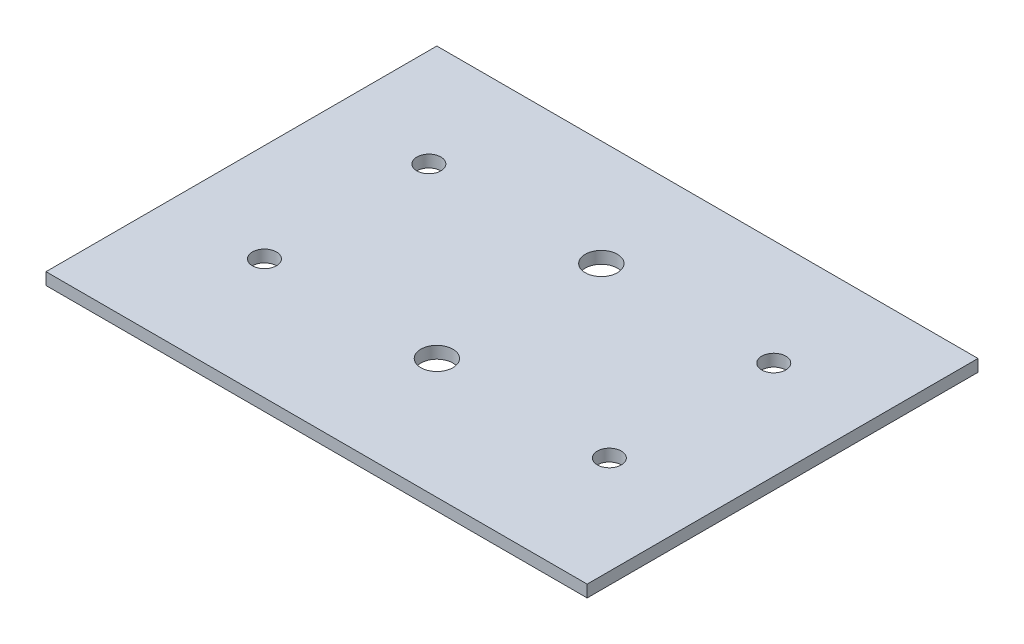
ISO-10303-21;
HEADER;
FILE_DESCRIPTION(('STEP AP214'),'2;1');
FILE_NAME('part.step','',(''),(''),'','','');
FILE_SCHEMA(('AUTOMOTIVE_DESIGN { 1 0 10303 214 1 1 1 1 }'));
ENDSEC;
DATA;
#1=APPLICATION_CONTEXT('core data for automotive mechanical design processes');
#2=APPLICATION_PROTOCOL_DEFINITION('international standard','automotive_design',2000,#1);
#3=PRODUCT_CONTEXT('',#1,'mechanical');
#4=PRODUCT('Part','Part','',(#3));
#5=PRODUCT_RELATED_PRODUCT_CATEGORY('part','',(#4));
#6=PRODUCT_DEFINITION_FORMATION('','',#4);
#7=PRODUCT_DEFINITION_CONTEXT('part definition',#1,'design');
#8=PRODUCT_DEFINITION('design','',#6,#7);
#9=PRODUCT_DEFINITION_SHAPE('','',#8);
#10=(LENGTH_UNIT() NAMED_UNIT(*) SI_UNIT(.MILLI.,.METRE.));
#11=(NAMED_UNIT(*) PLANE_ANGLE_UNIT() SI_UNIT($,.RADIAN.));
#12=(NAMED_UNIT(*) SI_UNIT($,.STERADIAN.) SOLID_ANGLE_UNIT());
#13=UNCERTAINTY_MEASURE_WITH_UNIT(LENGTH_MEASURE(1.E-05),#10,'distance_accuracy_value','');
#14=(GEOMETRIC_REPRESENTATION_CONTEXT(3) GLOBAL_UNCERTAINTY_ASSIGNED_CONTEXT((#13)) GLOBAL_UNIT_ASSIGNED_CONTEXT((#10,
#11,#12)) REPRESENTATION_CONTEXT('',''));
#15=CARTESIAN_POINT('',(0.,0.,0.));
#16=DIRECTION('',(0.,0.,1.));
#17=DIRECTION('',(1.,0.,0.));
#18=AXIS2_PLACEMENT_3D('',#15,#16,#17);
#19=CARTESIAN_POINT('',(0.,75.,0.));
#20=DIRECTION('',(0.,1.,0.));
#21=DIRECTION('',(0.,0.,1.));
#22=AXIS2_PLACEMENT_3D('',#19,#20,#21);
#23=PLANE('',#22);
#24=CARTESIAN_POINT('',(2.22044604925031E-13,75.,468.225517098027));
#25=DIRECTION('',(0.,1.,0.));
#26=DIRECTION('',(0.,0.,1.));
#27=AXIS2_PLACEMENT_3D('',#24,#25,#26);
#28=CIRCLE('',#27,100.);
#29=CARTESIAN_POINT('',(2.22044604925031E-13,75.,568.225517098027));
#30=VERTEX_POINT('',#29);
#31=EDGE_CURVE('E166',#30,#30,#28,.T.);
#32=ORIENTED_EDGE('',*,*,#31,.F.);
#33=EDGE_LOOP('',(#32));
#34=FACE_BOUND('',#33,.T.);
#35=CARTESIAN_POINT('',(-1075.,75.,468.225517098027));
#36=DIRECTION('',(0.,1.,0.));
#37=DIRECTION('',(0.,0.,-1.));
#38=AXIS2_PLACEMENT_3D('',#35,#36,#37);
#39=CIRCLE('',#38,74.9999999999999);
#40=CARTESIAN_POINT('',(-1075.,75.,393.225517098027));
#41=VERTEX_POINT('',#40);
#42=EDGE_CURVE('E150',#41,#41,#39,.T.);
#43=ORIENTED_EDGE('',*,*,#42,.F.);
#44=EDGE_LOOP('',(#43));
#45=FACE_BOUND('',#44,.T.);
#46=CARTESIAN_POINT('',(1075.,75.,468.225517098027));
#47=DIRECTION('',(0.,1.,0.));
#48=DIRECTION('',(0.,0.,1.));
#49=AXIS2_PLACEMENT_3D('',#46,#47,#48);
#50=CIRCLE('',#49,75.);
#51=CARTESIAN_POINT('',(1075.,75.,543.225517098027));
#52=VERTEX_POINT('',#51);
#53=EDGE_CURVE('E120',#52,#52,#50,.T.);
#54=ORIENTED_EDGE('',*,*,#53,.F.);
#55=EDGE_LOOP('',(#54));
#56=FACE_BOUND('',#55,.T.);
#57=DIRECTION('',(0.,0.,-1.));
#58=VECTOR('',#57,1.);
#59=CARTESIAN_POINT('',(1686.77379290496,75.,-1218.22551709803));
#60=LINE('',#59,#58);
#61=CARTESIAN_POINT('',(1686.77379290496,75.,1218.22551709803));
#62=VERTEX_POINT('',#61);
#63=CARTESIAN_POINT('',(1686.77379290496,75.,-1218.22551709803));
#64=VERTEX_POINT('',#63);
#65=EDGE_CURVE('E100',#62,#64,#60,.T.);
#66=ORIENTED_EDGE('',*,*,#65,.T.);
#67=DIRECTION('',(-1.,0.,0.));
#68=VECTOR('',#67,1.);
#69=CARTESIAN_POINT('',(-1686.77379290496,75.,-1218.22551709803));
#70=LINE('',#69,#68);
#71=CARTESIAN_POINT('',(-1686.77379290496,75.,-1218.22551709803));
#72=VERTEX_POINT('',#71);
#73=EDGE_CURVE('E95',#64,#72,#70,.T.);
#74=ORIENTED_EDGE('',*,*,#73,.T.);
#75=DIRECTION('',(0.,0.,1.));
#76=VECTOR('',#75,1.);
#77=CARTESIAN_POINT('',(-1686.77379290496,75.,-1218.22551709803));
#78=LINE('',#77,#76);
#79=CARTESIAN_POINT('',(-1686.77379290496,75.,1218.22551709803));
#80=VERTEX_POINT('',#79);
#81=EDGE_CURVE('E98',#72,#80,#78,.T.);
#82=ORIENTED_EDGE('',*,*,#81,.T.);
#83=DIRECTION('',(1.,0.,0.));
#84=VECTOR('',#83,1.);
#85=CARTESIAN_POINT('',(-1686.77379290496,75.,1218.22551709803));
#86=LINE('',#85,#84);
#87=EDGE_CURVE('E65',#80,#62,#86,.T.);
#88=ORIENTED_EDGE('',*,*,#87,.T.);
#89=EDGE_LOOP('',(#66,#74,#82,#88));
#90=FACE_BOUND('',#89,.T.);
#91=CARTESIAN_POINT('',(1075.,75.,-556.774482901973));
#92=DIRECTION('',(0.,1.,0.));
#93=DIRECTION('',(0.,0.,1.));
#94=AXIS2_PLACEMENT_3D('',#91,#92,#93);
#95=CIRCLE('',#94,75.);
#96=CARTESIAN_POINT('',(1075.,75.,-481.774482901973));
#97=VERTEX_POINT('',#96);
#98=EDGE_CURVE('E142',#97,#97,#95,.T.);
#99=ORIENTED_EDGE('',*,*,#98,.F.);
#100=EDGE_LOOP('',(#99));
#101=FACE_BOUND('',#100,.T.);
#102=CARTESIAN_POINT('',(-1075.,75.,-556.774482901973));
#103=DIRECTION('',(0.,1.,0.));
#104=DIRECTION('',(0.,0.,-1.));
#105=AXIS2_PLACEMENT_3D('',#102,#103,#104);
#106=CIRCLE('',#105,75.);
#107=CARTESIAN_POINT('',(-1075.,75.,-631.774482901972));
#108=VERTEX_POINT('',#107);
#109=EDGE_CURVE('E158',#108,#108,#106,.T.);
#110=ORIENTED_EDGE('',*,*,#109,.F.);
#111=EDGE_LOOP('',(#110));
#112=FACE_BOUND('',#111,.T.);
#113=CARTESIAN_POINT('',(0.,75.,-556.774482901973));
#114=DIRECTION('',(0.,1.,0.));
#115=DIRECTION('',(0.,0.,1.));
#116=AXIS2_PLACEMENT_3D('',#113,#114,#115);
#117=CIRCLE('',#116,100.);
#118=CARTESIAN_POINT('',(0.,75.,-456.774482901973));
#119=VERTEX_POINT('',#118);
#120=EDGE_CURVE('E174',#119,#119,#117,.T.);
#121=ORIENTED_EDGE('',*,*,#120,.F.);
#122=EDGE_LOOP('',(#121));
#123=FACE_BOUND('',#122,.T.);
#124=ADVANCED_FACE('F47',(#34,#45,#56,#90,#101,#112,#123),#23,.T.);
#125=CARTESIAN_POINT('',(0.,0.,0.));
#126=DIRECTION('',(0.,1.,0.));
#127=DIRECTION('',(0.,0.,1.));
#128=AXIS2_PLACEMENT_3D('',#125,#126,#127);
#129=PLANE('',#128);
#130=DIRECTION('',(0.,0.,-1.));
#131=VECTOR('',#130,1.);
#132=CARTESIAN_POINT('',(1686.77379290496,0.,-1218.22551709803));
#133=LINE('',#132,#131);
#134=CARTESIAN_POINT('',(1686.77379290496,0.,1218.22551709803));
#135=VERTEX_POINT('',#134);
#136=CARTESIAN_POINT('',(1686.77379290496,0.,-1218.22551709803));
#137=VERTEX_POINT('',#136);
#138=EDGE_CURVE('E116',#135,#137,#133,.T.);
#139=ORIENTED_EDGE('',*,*,#138,.F.);
#140=DIRECTION('',(1.,0.,0.));
#141=VECTOR('',#140,1.);
#142=CARTESIAN_POINT('',(-1686.77379290496,0.,1218.22551709803));
#143=LINE('',#142,#141);
#144=CARTESIAN_POINT('',(-1686.77379290496,0.,1218.22551709803));
#145=VERTEX_POINT('',#144);
#146=EDGE_CURVE('E88',#145,#135,#143,.T.);
#147=ORIENTED_EDGE('',*,*,#146,.F.);
#148=DIRECTION('',(0.,0.,1.));
#149=VECTOR('',#148,1.);
#150=CARTESIAN_POINT('',(-1686.77379290496,0.,-1218.22551709803));
#151=LINE('',#150,#149);
#152=CARTESIAN_POINT('',(-1686.77379290496,0.,-1218.22551709803));
#153=VERTEX_POINT('',#152);
#154=EDGE_CURVE('E82',#153,#145,#151,.T.);
#155=ORIENTED_EDGE('',*,*,#154,.F.);
#156=DIRECTION('',(-1.,0.,0.));
#157=VECTOR('',#156,1.);
#158=CARTESIAN_POINT('',(-1686.77379290496,0.,-1218.22551709803));
#159=LINE('',#158,#157);
#160=EDGE_CURVE('E105',#137,#153,#159,.T.);
#161=ORIENTED_EDGE('',*,*,#160,.F.);
#162=EDGE_LOOP('',(#139,#147,#155,#161));
#163=FACE_BOUND('',#162,.T.);
#164=CARTESIAN_POINT('',(1075.,0.,468.225517098027));
#165=DIRECTION('',(0.,1.,0.));
#166=DIRECTION('',(0.,0.,1.));
#167=AXIS2_PLACEMENT_3D('',#164,#165,#166);
#168=CIRCLE('',#167,75.);
#169=CARTESIAN_POINT('',(1075.,0.,543.225517098027));
#170=VERTEX_POINT('',#169);
#171=EDGE_CURVE('E138',#170,#170,#168,.T.);
#172=ORIENTED_EDGE('',*,*,#171,.T.);
#173=EDGE_LOOP('',(#172));
#174=FACE_BOUND('',#173,.T.);
#175=CARTESIAN_POINT('',(1075.,0.,-556.774482901973));
#176=DIRECTION('',(0.,1.,0.));
#177=DIRECTION('',(0.,0.,1.));
#178=AXIS2_PLACEMENT_3D('',#175,#176,#177);
#179=CIRCLE('',#178,75.);
#180=CARTESIAN_POINT('',(1075.,0.,-481.774482901973));
#181=VERTEX_POINT('',#180);
#182=EDGE_CURVE('E146',#181,#181,#179,.T.);
#183=ORIENTED_EDGE('',*,*,#182,.T.);
#184=EDGE_LOOP('',(#183));
#185=FACE_BOUND('',#184,.T.);
#186=CARTESIAN_POINT('',(-1075.,0.,468.225517098027));
#187=DIRECTION('',(0.,1.,0.));
#188=DIRECTION('',(0.,0.,-1.));
#189=AXIS2_PLACEMENT_3D('',#186,#187,#188);
#190=CIRCLE('',#189,74.9999999999999);
#191=CARTESIAN_POINT('',(-1075.,0.,393.225517098027));
#192=VERTEX_POINT('',#191);
#193=EDGE_CURVE('E154',#192,#192,#190,.T.);
#194=ORIENTED_EDGE('',*,*,#193,.T.);
#195=EDGE_LOOP('',(#194));
#196=FACE_BOUND('',#195,.T.);
#197=CARTESIAN_POINT('',(-1075.,0.,-556.774482901973));
#198=DIRECTION('',(0.,1.,0.));
#199=DIRECTION('',(0.,0.,-1.));
#200=AXIS2_PLACEMENT_3D('',#197,#198,#199);
#201=CIRCLE('',#200,75.);
#202=CARTESIAN_POINT('',(-1075.,0.,-631.774482901972));
#203=VERTEX_POINT('',#202);
#204=EDGE_CURVE('E162',#203,#203,#201,.T.);
#205=ORIENTED_EDGE('',*,*,#204,.T.);
#206=EDGE_LOOP('',(#205));
#207=FACE_BOUND('',#206,.T.);
#208=CARTESIAN_POINT('',(2.22044604925031E-13,0.,468.225517098027));
#209=DIRECTION('',(0.,1.,0.));
#210=DIRECTION('',(0.,0.,1.));
#211=AXIS2_PLACEMENT_3D('',#208,#209,#210);
#212=CIRCLE('',#211,100.);
#213=CARTESIAN_POINT('',(2.22044604925031E-13,0.,568.225517098027));
#214=VERTEX_POINT('',#213);
#215=EDGE_CURVE('E170',#214,#214,#212,.T.);
#216=ORIENTED_EDGE('',*,*,#215,.T.);
#217=EDGE_LOOP('',(#216));
#218=FACE_BOUND('',#217,.T.);
#219=CARTESIAN_POINT('',(0.,0.,-556.774482901973));
#220=DIRECTION('',(0.,1.,0.));
#221=DIRECTION('',(0.,0.,1.));
#222=AXIS2_PLACEMENT_3D('',#219,#220,#221);
#223=CIRCLE('',#222,100.);
#224=CARTESIAN_POINT('',(0.,0.,-456.774482901973));
#225=VERTEX_POINT('',#224);
#226=EDGE_CURVE('E178',#225,#225,#223,.T.);
#227=ORIENTED_EDGE('',*,*,#226,.T.);
#228=EDGE_LOOP('',(#227));
#229=FACE_BOUND('',#228,.T.);
#230=ADVANCED_FACE('F133',(#163,#174,#185,#196,#207,#218,#229),#129,.F.);
#231=CARTESIAN_POINT('',(1686.77379290496,75.,-1218.22551709803));
#232=DIRECTION('',(-1.,0.,0.));
#233=DIRECTION('',(0.,0.,1.));
#234=AXIS2_PLACEMENT_3D('',#231,#232,#233);
#235=PLANE('',#234);
#236=ORIENTED_EDGE('',*,*,#138,.T.);
#237=DIRECTION('',(0.,-1.,0.));
#238=VECTOR('',#237,1.);
#239=CARTESIAN_POINT('',(1686.77379290496,75.,-1218.22551709803));
#240=LINE('',#239,#238);
#241=EDGE_CURVE('E11',#64,#137,#240,.T.);
#242=ORIENTED_EDGE('',*,*,#241,.F.);
#243=ORIENTED_EDGE('',*,*,#65,.F.);
#244=DIRECTION('',(0.,-1.,0.));
#245=VECTOR('',#244,1.);
#246=CARTESIAN_POINT('',(1686.77379290496,75.,1218.22551709803));
#247=LINE('',#246,#245);
#248=EDGE_CURVE('E112',#62,#135,#247,.T.);
#249=ORIENTED_EDGE('',*,*,#248,.T.);
#250=EDGE_LOOP('',(#236,#242,#243,#249));
#251=FACE_BOUND('',#250,.T.);
#252=ADVANCED_FACE('F49',(#251),#235,.F.);
#253=CARTESIAN_POINT('',(-1686.77379290496,75.,-1218.22551709803));
#254=DIRECTION('',(0.,0.,1.));
#255=DIRECTION('',(1.,0.,0.));
#256=AXIS2_PLACEMENT_3D('',#253,#254,#255);
#257=PLANE('',#256);
#258=ORIENTED_EDGE('',*,*,#160,.T.);
#259=DIRECTION('',(0.,-1.,0.));
#260=VECTOR('',#259,1.);
#261=CARTESIAN_POINT('',(-1686.77379290496,75.,-1218.22551709803));
#262=LINE('',#261,#260);
#263=EDGE_CURVE('E57',#72,#153,#262,.T.);
#264=ORIENTED_EDGE('',*,*,#263,.F.);
#265=ORIENTED_EDGE('',*,*,#73,.F.);
#266=ORIENTED_EDGE('',*,*,#241,.T.);
#267=EDGE_LOOP('',(#258,#264,#265,#266));
#268=FACE_BOUND('',#267,.T.);
#269=ADVANCED_FACE('F104',(#268),#257,.F.);
#270=CARTESIAN_POINT('',(-1686.77379290496,75.,-1218.22551709803));
#271=DIRECTION('',(1.,0.,0.));
#272=DIRECTION('',(0.,0.,-1.));
#273=AXIS2_PLACEMENT_3D('',#270,#271,#272);
#274=PLANE('',#273);
#275=ORIENTED_EDGE('',*,*,#154,.T.);
#276=DIRECTION('',(0.,-1.,0.));
#277=VECTOR('',#276,1.);
#278=CARTESIAN_POINT('',(-1686.77379290496,75.,1218.22551709803));
#279=LINE('',#278,#277);
#280=EDGE_CURVE('E107',#80,#145,#279,.T.);
#281=ORIENTED_EDGE('',*,*,#280,.F.);
#282=ORIENTED_EDGE('',*,*,#81,.F.);
#283=ORIENTED_EDGE('',*,*,#263,.T.);
#284=EDGE_LOOP('',(#275,#281,#282,#283));
#285=FACE_BOUND('',#284,.T.);
#286=ADVANCED_FACE('F108',(#285),#274,.F.);
#287=CARTESIAN_POINT('',(-1686.77379290496,75.,1218.22551709803));
#288=DIRECTION('',(0.,0.,-1.));
#289=DIRECTION('',(-1.,0.,0.));
#290=AXIS2_PLACEMENT_3D('',#287,#288,#289);
#291=PLANE('',#290);
#292=ORIENTED_EDGE('',*,*,#146,.T.);
#293=ORIENTED_EDGE('',*,*,#248,.F.);
#294=ORIENTED_EDGE('',*,*,#87,.F.);
#295=ORIENTED_EDGE('',*,*,#280,.T.);
#296=EDGE_LOOP('',(#292,#293,#294,#295));
#297=FACE_BOUND('',#296,.T.);
#298=ADVANCED_FACE('F130',(#297),#291,.F.);
#299=CARTESIAN_POINT('',(1075.,75.,468.225517098027));
#300=DIRECTION('',(0.,-1.,0.));
#301=DIRECTION('',(0.,0.,-1.));
#302=AXIS2_PLACEMENT_3D('',#299,#300,#301);
#303=CYLINDRICAL_SURFACE('',#302,75.);
#304=ORIENTED_EDGE('',*,*,#53,.T.);
#305=EDGE_LOOP('',(#304));
#306=FACE_BOUND('',#305,.T.);
#307=ORIENTED_EDGE('',*,*,#171,.F.);
#308=EDGE_LOOP('',(#307));
#309=FACE_BOUND('',#308,.T.);
#310=ADVANCED_FACE('F199',(#306,#309),#303,.F.);
#311=CARTESIAN_POINT('',(1075.,75.,-556.774482901973));
#312=DIRECTION('',(0.,-1.,0.));
#313=DIRECTION('',(0.,0.,-1.));
#314=AXIS2_PLACEMENT_3D('',#311,#312,#313);
#315=CYLINDRICAL_SURFACE('',#314,75.);
#316=ORIENTED_EDGE('',*,*,#98,.T.);
#317=EDGE_LOOP('',(#316));
#318=FACE_BOUND('',#317,.T.);
#319=ORIENTED_EDGE('',*,*,#182,.F.);
#320=EDGE_LOOP('',(#319));
#321=FACE_BOUND('',#320,.T.);
#322=ADVANCED_FACE('F244',(#318,#321),#315,.F.);
#323=CARTESIAN_POINT('',(-1075.,75.,468.225517098027));
#324=DIRECTION('',(0.,-1.,0.));
#325=DIRECTION('',(0.,0.,-1.));
#326=AXIS2_PLACEMENT_3D('',#323,#324,#325);
#327=CYLINDRICAL_SURFACE('',#326,74.9999999999999);
#328=ORIENTED_EDGE('',*,*,#42,.T.);
#329=EDGE_LOOP('',(#328));
#330=FACE_BOUND('',#329,.T.);
#331=ORIENTED_EDGE('',*,*,#193,.F.);
#332=EDGE_LOOP('',(#331));
#333=FACE_BOUND('',#332,.T.);
#334=ADVANCED_FACE('F252',(#330,#333),#327,.F.);
#335=CARTESIAN_POINT('',(-1075.,75.,-556.774482901973));
#336=DIRECTION('',(0.,-1.,0.));
#337=DIRECTION('',(0.,0.,-1.));
#338=AXIS2_PLACEMENT_3D('',#335,#336,#337);
#339=CYLINDRICAL_SURFACE('',#338,75.);
#340=ORIENTED_EDGE('',*,*,#109,.T.);
#341=EDGE_LOOP('',(#340));
#342=FACE_BOUND('',#341,.T.);
#343=ORIENTED_EDGE('',*,*,#204,.F.);
#344=EDGE_LOOP('',(#343));
#345=FACE_BOUND('',#344,.T.);
#346=ADVANCED_FACE('F260',(#342,#345),#339,.F.);
#347=CARTESIAN_POINT('',(2.22044604925031E-13,75.,468.225517098027));
#348=DIRECTION('',(0.,-1.,0.));
#349=DIRECTION('',(0.,0.,-1.));
#350=AXIS2_PLACEMENT_3D('',#347,#348,#349);
#351=CYLINDRICAL_SURFACE('',#350,100.);
#352=ORIENTED_EDGE('',*,*,#31,.T.);
#353=EDGE_LOOP('',(#352));
#354=FACE_BOUND('',#353,.T.);
#355=ORIENTED_EDGE('',*,*,#215,.F.);
#356=EDGE_LOOP('',(#355));
#357=FACE_BOUND('',#356,.T.);
#358=ADVANCED_FACE('F269',(#354,#357),#351,.F.);
#359=CARTESIAN_POINT('',(0.,75.,-556.774482901973));
#360=DIRECTION('',(0.,-1.,0.));
#361=DIRECTION('',(0.,0.,-1.));
#362=AXIS2_PLACEMENT_3D('',#359,#360,#361);
#363=CYLINDRICAL_SURFACE('',#362,100.);
#364=ORIENTED_EDGE('',*,*,#120,.T.);
#365=EDGE_LOOP('',(#364));
#366=FACE_BOUND('',#365,.T.);
#367=ORIENTED_EDGE('',*,*,#226,.F.);
#368=EDGE_LOOP('',(#367));
#369=FACE_BOUND('',#368,.T.);
#370=ADVANCED_FACE('F186',(#366,#369),#363,.F.);
#371=CLOSED_SHELL('',(#124,#230,#252,#269,#286,#298,#310,#322,#334,#346,#358,#370));
#372=MANIFOLD_SOLID_BREP('B2',#371);
#373=ADVANCED_BREP_SHAPE_REPRESENTATION('',(#18,#372),#14);
#374=SHAPE_DEFINITION_REPRESENTATION(#9,#373);
ENDSEC;
END-ISO-10303-21;
